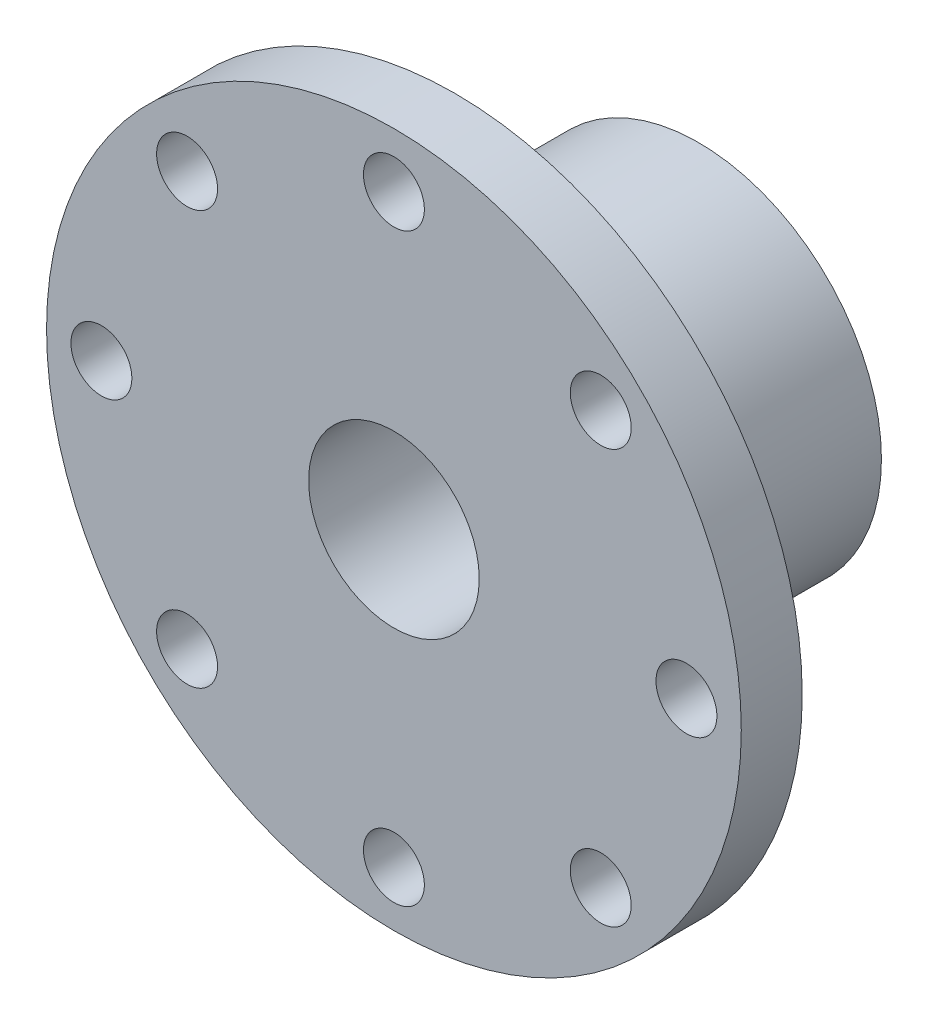
ISO-10303-21;
HEADER;
FILE_DESCRIPTION(('STEP AP214'),'2;1');
FILE_NAME('part.step','',(''),(''),'','','');
FILE_SCHEMA(('AUTOMOTIVE_DESIGN { 1 0 10303 214 1 1 1 1 }'));
ENDSEC;
DATA;
#1=APPLICATION_CONTEXT('core data for automotive mechanical design processes');
#2=APPLICATION_PROTOCOL_DEFINITION('international standard','automotive_design',2000,#1);
#3=PRODUCT_CONTEXT('',#1,'mechanical');
#4=PRODUCT('Part','Part','',(#3));
#5=PRODUCT_RELATED_PRODUCT_CATEGORY('part','',(#4));
#6=PRODUCT_DEFINITION_FORMATION('','',#4);
#7=PRODUCT_DEFINITION_CONTEXT('part definition',#1,'design');
#8=PRODUCT_DEFINITION('design','',#6,#7);
#9=PRODUCT_DEFINITION_SHAPE('','',#8);
#10=(LENGTH_UNIT() NAMED_UNIT(*) SI_UNIT(.MILLI.,.METRE.));
#11=(NAMED_UNIT(*) PLANE_ANGLE_UNIT() SI_UNIT($,.RADIAN.));
#12=(NAMED_UNIT(*) SI_UNIT($,.STERADIAN.) SOLID_ANGLE_UNIT());
#13=UNCERTAINTY_MEASURE_WITH_UNIT(LENGTH_MEASURE(1.E-05),#10,'distance_accuracy_value','');
#14=(GEOMETRIC_REPRESENTATION_CONTEXT(3) GLOBAL_UNCERTAINTY_ASSIGNED_CONTEXT((#13)) GLOBAL_UNIT_ASSIGNED_CONTEXT((#10,
#11,#12)) REPRESENTATION_CONTEXT('',''));
#15=CARTESIAN_POINT('',(0.,0.,0.));
#16=DIRECTION('',(0.,0.,1.));
#17=DIRECTION('',(1.,0.,0.));
#18=AXIS2_PLACEMENT_3D('',#15,#16,#17);
#19=CARTESIAN_POINT('',(0.,0.,0.));
#20=DIRECTION('',(0.,0.,1.));
#21=DIRECTION('',(1.,0.,0.));
#22=AXIS2_PLACEMENT_3D('',#19,#20,#21);
#23=PLANE('',#22);
#24=CARTESIAN_POINT('',(0.,0.,0.));
#25=DIRECTION('',(0.,0.,1.));
#26=DIRECTION('',(1.,0.,0.));
#27=AXIS2_PLACEMENT_3D('',#24,#25,#26);
#28=CIRCLE('',#27,15.);
#29=CARTESIAN_POINT('',(15.,0.,0.));
#30=VERTEX_POINT('',#29);
#31=EDGE_CURVE('E51',#30,#30,#28,.T.);
#32=ORIENTED_EDGE('',*,*,#31,.F.);
#33=EDGE_LOOP('',(#32));
#34=FACE_BOUND('',#33,.T.);
#35=CARTESIAN_POINT('',(0.,0.,0.));
#36=DIRECTION('',(0.,0.,1.));
#37=DIRECTION('',(1.,0.,0.));
#38=AXIS2_PLACEMENT_3D('',#35,#36,#37);
#39=CIRCLE('',#38,7.);
#40=CARTESIAN_POINT('',(7.,0.,0.));
#41=VERTEX_POINT('',#40);
#42=EDGE_CURVE('E57',#41,#41,#39,.T.);
#43=ORIENTED_EDGE('',*,*,#42,.T.);
#44=EDGE_LOOP('',(#43));
#45=FACE_BOUND('',#44,.T.);
#46=ADVANCED_FACE('F36',(#34,#45),#23,.F.);
#47=CARTESIAN_POINT('',(0.,0.,20.));
#48=DIRECTION('',(0.,0.,-1.));
#49=DIRECTION('',(-1.,0.,0.));
#50=AXIS2_PLACEMENT_3D('',#47,#48,#49);
#51=CYLINDRICAL_SURFACE('',#50,15.);
#52=CARTESIAN_POINT('',(0.,-15.,13.));
#53=CARTESIAN_POINT('',(0.166730720377901,-14.9999969274261,12.999993866505));
#54=CARTESIAN_POINT('',(0.333538980604568,-14.9971915553469,12.9860534710971));
#55=CARTESIAN_POINT('',(0.662440523067059,-14.9862709686969,12.9307044996543));
#56=CARTESIAN_POINT('',(0.824529952624069,-14.9781515358056,12.8892741015955));
#57=CARTESIAN_POINT('',(1.13919091578994,-14.9575094783486,12.7802761791376));
#58=CARTESIAN_POINT('',(1.2917714037994,-14.9449910723015,12.7127336894659));
#59=CARTESIAN_POINT('',(1.58342396659268,-14.9169119410594,12.5535032574661));
#60=CARTESIAN_POINT('',(1.72249684522744,-14.9013513970712,12.4618167531784));
#61=CARTESIAN_POINT('',(1.9850804319446,-14.8686649598991,12.2555845171257));
#62=CARTESIAN_POINT('',(2.10838185347558,-14.8515223651304,12.1407749338264));
#63=CARTESIAN_POINT('',(2.33411026982409,-14.8177254135776,11.8921227508249));
#64=CARTESIAN_POINT('',(2.43653563431128,-14.8010710950127,11.7582786659946));
#65=CARTESIAN_POINT('',(2.61849526004286,-14.7699732543785,11.4738514209644));
#66=CARTESIAN_POINT('',(2.6978128165976,-14.7555512209484,11.3231270686109));
#67=CARTESIAN_POINT('',(2.82991699974093,-14.7307880417525,11.0101545429878));
#68=CARTESIAN_POINT('',(2.88270624731171,-14.7204464928588,10.847907509961));
#69=CARTESIAN_POINT('',(2.95957589965448,-14.7051841575661,10.5187469082763));
#70=CARTESIAN_POINT('',(2.98402349387633,-14.7001941032156,10.3519223675733));
#71=CARTESIAN_POINT('',(3.00465638317836,-14.6959912518188,10.016470535907));
#72=CARTESIAN_POINT('',(3.0008445681405,-14.6967778640352,9.84784343103956));
#73=CARTESIAN_POINT('',(2.96536371930546,-14.7039765344455,9.51625963593699));
#74=CARTESIAN_POINT('',(2.93411562073172,-14.7103035857629,9.35325578311806));
#75=CARTESIAN_POINT('',(2.84531365386915,-14.7277363848,9.03485177001099));
#76=CARTESIAN_POINT('',(2.78775852930204,-14.7388423607334,8.87945197324298));
#77=CARTESIAN_POINT('',(2.64757435102416,-14.7646685550122,8.5794542148892));
#78=CARTESIAN_POINT('',(2.56477845369634,-14.7794126944111,8.43493636129248));
#79=CARTESIAN_POINT('',(2.37658072371804,-14.8108385631919,8.16168745008156));
#80=CARTESIAN_POINT('',(2.27117629307049,-14.827520515151,8.03295820944653));
#81=CARTESIAN_POINT('',(2.03849980368175,-14.8613106372439,7.79251179262919));
#82=CARTESIAN_POINT('',(1.91086848363734,-14.8784210763271,7.68114229642261));
#83=CARTESIAN_POINT('',(1.63855507218603,-14.9108654614323,7.48133846109633));
#84=CARTESIAN_POINT('',(1.49387276213817,-14.9261993846692,7.39290441611926));
#85=CARTESIAN_POINT('',(1.19117816063676,-14.9534007048266,7.24141747232207));
#86=CARTESIAN_POINT('',(1.0331454587559,-14.9652626654482,7.17840431906639));
#87=CARTESIAN_POINT('',(0.708446929345997,-14.9841422696357,7.0799185778843));
#88=CARTESIAN_POINT('',(0.54178215021735,-14.9911605000159,7.04444265377912));
#89=CARTESIAN_POINT('',(0.207538216881453,-14.999480156006,7.00253063861717));
#90=CARTESIAN_POINT('',(0.0400209849767297,-15.0008752395741,6.99561874137919));
#91=CARTESIAN_POINT('',(-0.293774802578142,-14.9980515579031,7.00974957682654));
#92=CARTESIAN_POINT('',(-0.460053427331379,-14.9938331082434,7.03079073805779));
#93=CARTESIAN_POINT('',(-0.785116979839622,-14.9803149602405,7.09983512063187));
#94=CARTESIAN_POINT('',(-0.943955845019709,-14.9710612921262,7.14759420549371));
#95=CARTESIAN_POINT('',(-1.251370882499,-14.948506561831,7.26845194796743));
#96=CARTESIAN_POINT('',(-1.39994628491262,-14.9352051964268,7.34155250403049));
#97=CARTESIAN_POINT('',(-1.68462352105865,-14.9057973459988,7.51204747195394));
#98=CARTESIAN_POINT('',(-1.82055038025656,-14.8896585131116,7.60972834311684));
#99=CARTESIAN_POINT('',(-2.07425405735762,-14.8564420448965,7.82622757362184));
#100=CARTESIAN_POINT('',(-2.19202892679229,-14.8393643090516,7.9450481991996));
#101=CARTESIAN_POINT('',(-2.40792177232253,-14.8058791067089,8.20262005567337));
#102=CARTESIAN_POINT('',(-2.50571310734596,-14.7894858069991,8.34164723266401));
#103=CARTESIAN_POINT('',(-2.67655626015362,-14.7595257538858,8.63443408407004));
#104=CARTESIAN_POINT('',(-2.74960906776871,-14.7459588874003,8.78819316872066));
#105=CARTESIAN_POINT('',(-2.86845552474588,-14.7233022175315,9.10530473844865));
#106=CARTESIAN_POINT('',(-2.91439049937315,-14.7141892461656,9.26860252363096));
#107=CARTESIAN_POINT('',(-2.97812595488159,-14.7014231037608,9.60080036047272));
#108=CARTESIAN_POINT('',(-2.99593010467534,-14.6977692207333,9.76969967862804));
#109=CARTESIAN_POINT('',(-3.0027627326024,-14.6963744889414,10.105026593633));
#110=CARTESIAN_POINT('',(-2.99230736421269,-14.698527575679,10.271443446781));
#111=CARTESIAN_POINT('',(-2.94405691230018,-14.7082672045384,10.6000949497151));
#112=CARTESIAN_POINT('',(-2.90626204838789,-14.7158537030151,10.7623296330844));
#113=CARTESIAN_POINT('',(-2.80463570549686,-14.7355579265748,11.0776831337216));
#114=CARTESIAN_POINT('',(-2.74086752015203,-14.7476646305649,11.2308230815072));
#115=CARTESIAN_POINT('',(-2.58916393380481,-14.7750514492251,11.5243111622033));
#116=CARTESIAN_POINT('',(-2.50122650632464,-14.7903318299668,11.6646582211754));
#117=CARTESIAN_POINT('',(-2.30191774435924,-14.8226688156968,11.9311467164509));
#118=CARTESIAN_POINT('',(-2.19017366170554,-14.839751187291,12.0570062958028));
#119=CARTESIAN_POINT('',(-1.94719310703942,-14.8735824561586,12.2883586165875));
#120=CARTESIAN_POINT('',(-1.81595216146,-14.8903312758955,12.3938466709518));
#121=CARTESIAN_POINT('',(-1.53605288726474,-14.9218149716391,12.5825039318393));
#122=CARTESIAN_POINT('',(-1.3872266532895,-14.9365269365774,12.6654280098401));
#123=CARTESIAN_POINT('',(-1.0774990828222,-14.96205375255,12.8049583677898));
#124=CARTESIAN_POINT('',(-0.916608782589376,-14.9728721141585,12.8615883685975));
#125=CARTESIAN_POINT('',(-0.629464466771335,-14.9872911778611,12.9359558441341));
#126=CARTESIAN_POINT('',(-0.504844992041351,-14.9920290947535,12.9599295811233));
#127=CARTESIAN_POINT('',(-0.253498575630199,-14.9983846241968,12.9919537370751));
#128=CARTESIAN_POINT('',(-0.126771701245856,-15.0000023361946,13.0000046635293));
#129=CARTESIAN_POINT('',(0.,-15.,13.));
#130=B_SPLINE_CURVE_WITH_KNOTS('',3,(#52,#53,#54,#55,#56,#57,#58,#59,#60,#61,#62,#63,#64,#65,
#66,#67,#68,#69,#70,#71,#72,#73,#74,#75,#76,#77,#78,#79,#80,#81,#82,#83,#84,#85,#86,#87,#88,#89,
#90,#91,#92,#93,#94,#95,#96,#97,#98,#99,#100,#101,#102,#103,#104,#105,#106,#107,#108,#109,#110,
#111,#112,#113,#114,#115,#116,#117,#118,#119,#120,#121,#122,#123,#124,#125,#126,#127,#128,#129),
.UNSPECIFIED.,.T.,.F.,(4,2,2,2,2,2,2,2,2,2,2,2,2,2,2,2,2,2,2,2,2,2,2,2,2,2,2,2,2,2,2,2,2,2,2,2,
2,2,4),(0.,0.499728391983775,0.99985395207397,1.49950120575103,1.99911870669259,
2.50479801033656,3.0105167902421,3.52083585017768,4.03110448095592,4.53468555310762,
5.03821512843675,5.53415181018835,6.03011217761189,6.52942470610778,7.02879464249011,
7.53714757474052,8.04550702619461,8.55465824562072,9.06374777094108,9.56432207028796,
10.064868229736,10.5609136185217,11.0569961764807,11.5591519810008,12.0613616503779,
12.5712188573768,13.081055661704,13.5882114309817,14.0953010499124,14.593191677031,
15.0910783047783,15.5877588375933,16.084481027456,16.5896422871743,17.0949196359879,
17.6054849002691,18.1155886655256,18.4955632586968,18.8755257411299),.UNSPECIFIED.);
#131=CARTESIAN_POINT('',(0.,-15.,13.));
#132=VERTEX_POINT('',#131);
#133=EDGE_CURVE('E80',#132,#132,#130,.T.);
#134=ORIENTED_EDGE('',*,*,#133,.T.);
#135=EDGE_LOOP('',(#134));
#136=FACE_BOUND('',#135,.T.);
#137=CARTESIAN_POINT('',(0.,0.,20.));
#138=DIRECTION('',(0.,0.,1.));
#139=DIRECTION('',(1.,0.,0.));
#140=AXIS2_PLACEMENT_3D('',#137,#138,#139);
#141=CIRCLE('',#140,15.);
#142=CARTESIAN_POINT('',(15.,0.,20.));
#143=VERTEX_POINT('',#142);
#144=EDGE_CURVE('E10',#143,#143,#141,.T.);
#145=ORIENTED_EDGE('',*,*,#144,.F.);
#146=EDGE_LOOP('',(#145));
#147=FACE_BOUND('',#146,.T.);
#148=ORIENTED_EDGE('',*,*,#31,.T.);
#149=EDGE_LOOP('',(#148));
#150=FACE_BOUND('',#149,.T.);
#151=ADVANCED_FACE('F38',(#136,#147,#150),#51,.T.);
#152=CARTESIAN_POINT('',(0.,0.,20.));
#153=DIRECTION('',(0.,0.,-1.));
#154=DIRECTION('',(-1.,0.,0.));
#155=AXIS2_PLACEMENT_3D('',#152,#153,#154);
#156=CYLINDRICAL_SURFACE('',#155,7.);
#157=CARTESIAN_POINT('',(0.,-7.,13.));
#158=CARTESIAN_POINT('',(0.160281740269092,-6.9999940839629,12.9999925304185));
#159=CARTESIAN_POINT('',(0.320833907522431,-6.99443250051265,12.9870786839035));
#160=CARTESIAN_POINT('',(0.637349314958985,-6.97273920628719,12.9359176345735));
#161=CARTESIAN_POINT('',(0.793299928144208,-6.95658080950724,12.8976064709267));
#162=CARTESIAN_POINT('',(1.0955347051483,-6.91541630739346,12.7973302363749));
#163=CARTESIAN_POINT('',(1.24185033642246,-6.89044089228941,12.7354471561946));
#164=CARTESIAN_POINT('',(1.5218733278968,-6.83405660276648,12.5901355814363));
#165=CARTESIAN_POINT('',(1.65558409053381,-6.80264947176647,12.5067129239082));
#166=CARTESIAN_POINT('',(1.91384144205639,-6.73467821875549,12.3160723523121));
#167=CARTESIAN_POINT('',(2.03764045493602,-6.69793895962371,12.2079047401042));
#168=CARTESIAN_POINT('',(2.26599040232609,-6.62417654338771,11.9728561314992));
#169=CARTESIAN_POINT('',(2.3705306503261,-6.5871532404671,11.8459648153973));
#170=CARTESIAN_POINT('',(2.56285686126493,-6.51482055271223,11.5689672772845));
#171=CARTESIAN_POINT('',(2.64946811752636,-6.47970460244924,11.4179895419707));
#172=CARTESIAN_POINT('',(2.79573199408101,-6.41796168635026,11.101890571811));
#173=CARTESIAN_POINT('',(2.8553992914263,-6.39133010120133,10.9367770955138));
#174=CARTESIAN_POINT('',(2.94294919918375,-6.35147799087276,10.6056992616908));
#175=CARTESIAN_POINT('',(2.97227494401777,-6.33765221435539,10.4401922982205));
#176=CARTESIAN_POINT('',(3.00280607158394,-6.32324849688131,10.1060740303897));
#177=CARTESIAN_POINT('',(3.00402828615096,-6.32266262625149,9.93746464470862));
#178=CARTESIAN_POINT('',(2.97939999510613,-6.33429573902539,9.61670009628145));
#179=CARTESIAN_POINT('',(2.95576113815072,-6.34546870930158,9.464329376668));
#180=CARTESIAN_POINT('',(2.88580772808799,-6.37758411517576,9.16597241409867));
#181=CARTESIAN_POINT('',(2.83948852833539,-6.39852855266591,9.01998748611386));
#182=CARTESIAN_POINT('',(2.72457659070691,-6.44830685655465,8.73475284856477));
#183=CARTESIAN_POINT('',(2.65551974428426,-6.47730295111391,8.59571970578186));
#184=CARTESIAN_POINT('',(2.49742304873013,-6.53988493882129,8.33065367593057));
#185=CARTESIAN_POINT('',(2.40837507480489,-6.57347269593628,8.20462610507051));
#186=CARTESIAN_POINT('',(2.20343405392229,-6.64512404535213,7.95722249637862));
#187=CARTESIAN_POINT('',(2.08584728856133,-6.68331855389208,7.83728327052803));
#188=CARTESIAN_POINT('',(1.83187332405077,-6.75734605758523,7.61832840934405));
#189=CARTESIAN_POINT('',(1.6954812162799,-6.79317843254652,7.51931825412179));
#190=CARTESIAN_POINT('',(1.40318582301272,-6.8595969368957,7.34275606719303));
#191=CARTESIAN_POINT('',(1.24687114970232,-6.89002455033727,7.26582098129442));
#192=CARTESIAN_POINT('',(0.921879694158937,-6.94097396260558,7.13984976238528));
#193=CARTESIAN_POINT('',(0.753210215657667,-6.9615015603998,7.0907972940223));
#194=CARTESIAN_POINT('',(0.420276238941372,-6.98923526893385,7.02506613954103));
#195=CARTESIAN_POINT('',(0.256457961010926,-6.99723249964589,7.00646123468561));
#196=CARTESIAN_POINT('',(-0.0721433011185054,-7.00155416651738,6.99637042359177));
#197=CARTESIAN_POINT('',(-0.236925971900555,-6.99788220531666,7.00487614746763));
#198=CARTESIAN_POINT('',(-0.55354243962667,-6.9797867632015,7.04741563205481));
#199=CARTESIAN_POINT('',(-0.705598931504216,-6.96594519473644,7.08006832144833));
#200=CARTESIAN_POINT('',(-1.00189113639242,-6.92953888009974,7.16802089423816));
#201=CARTESIAN_POINT('',(-1.14612587370002,-6.90697304848521,7.22332359572216));
#202=CARTESIAN_POINT('',(-1.42777696523888,-6.85438751513719,7.35680115950212));
#203=CARTESIAN_POINT('',(-1.56483974951836,-6.82415705388474,7.43563633022606));
#204=CARTESIAN_POINT('',(-1.82428490564705,-6.75942988391438,7.61321894447594));
#205=CARTESIAN_POINT('',(-1.94666097512992,-6.72493135648758,7.71197488802329));
#206=CARTESIAN_POINT('',(-2.18296759532595,-6.65214788697903,7.93528958784289));
#207=CARTESIAN_POINT('',(-2.29556617553686,-6.61377354998591,8.06123221006139));
#208=CARTESIAN_POINT('',(-2.49843431443676,-6.53984037690252,8.33078229863161));
#209=CARTESIAN_POINT('',(-2.58869766421195,-6.50428232556792,8.47439466037483));
#210=CARTESIAN_POINT('',(-2.74563875632303,-6.43962969285319,8.77881385295857));
#211=CARTESIAN_POINT('',(-2.81186415020233,-6.41066255987443,8.93988300904999));
#212=CARTESIAN_POINT('',(-2.91565885028324,-6.36413607530145,9.2725263267395));
#213=CARTESIAN_POINT('',(-2.95325364225748,-6.346566580073,9.44409099832457));
#214=CARTESIAN_POINT('',(-2.9961194841997,-6.32643481136621,9.77799117233295));
#215=CARTESIAN_POINT('',(-3.00374693238451,-6.3227792566546,9.93995926751058));
#216=CARTESIAN_POINT('',(-2.99282649265778,-6.32795618271386,10.2627897469115));
#217=CARTESIAN_POINT('',(-2.97428322126543,-6.33678646098226,10.4236523211193));
#218=CARTESIAN_POINT('',(-2.91356431394149,-6.3649165389077,10.7310416962734));
#219=CARTESIAN_POINT('',(-2.87266975661121,-6.38364713099396,10.8778787915708));
#220=CARTESIAN_POINT('',(-2.769702223632,-6.42898875831973,11.1626207660839));
#221=CARTESIAN_POINT('',(-2.70762322652258,-6.45560203384715,11.3005230924077));
#222=CARTESIAN_POINT('',(-2.55963250501149,-6.5157524732596,11.5728207086796));
#223=CARTESIAN_POINT('',(-2.47248232196069,-6.5496164957701,11.7064691536948));
#224=CARTESIAN_POINT('',(-2.2784960092513,-6.61959778926566,11.9579823612475));
#225=CARTESIAN_POINT('',(-2.17165243666714,-6.6557159087398,12.0758411270492));
#226=CARTESIAN_POINT('',(-1.93135048700133,-6.72955424641834,12.3020036355007));
#227=CARTESIAN_POINT('',(-1.79645724733279,-6.76717599448736,12.4088195655728));
#228=CARTESIAN_POINT('',(-1.50919760355001,-6.83696477009089,12.5984397600312));
#229=CARTESIAN_POINT('',(-1.35682332068822,-6.86912932173673,12.6812331375999));
#230=CARTESIAN_POINT('',(-1.11954532843042,-6.91035442086788,12.7845926909895));
#231=CARTESIAN_POINT('',(-1.03957288024831,-6.92286397965452,12.8154332908018));
#232=CARTESIAN_POINT('',(-0.876970802782698,-6.94533202163241,12.8702382020223));
#233=CARTESIAN_POINT('',(-0.794342461515167,-6.95529172101821,12.8942057922754));
#234=CARTESIAN_POINT('',(-0.627265567421397,-6.97234378079151,12.9349477172834));
#235=CARTESIAN_POINT('',(-0.542821986677286,-6.97944312738119,12.9517395843805));
#236=CARTESIAN_POINT('',(-0.372647906839315,-6.99059319635283,12.9780087142034));
#237=CARTESIAN_POINT('',(-0.286918376030205,-6.99464610559385,12.9874912240139));
#238=CARTESIAN_POINT('',(-0.167492669563776,-6.99807592564235,12.9955082749436));
#239=CARTESIAN_POINT('',(-0.134021137958666,-6.99879677015532,12.9971918541176));
#240=CARTESIAN_POINT('',(-0.0670370145842108,-6.99975942751561,12.9994385012841));
#241=CARTESIAN_POINT('',(-0.0335244225617051,-7.0000012373944,13.0000015623327));
#242=CARTESIAN_POINT('',(0.,-7.,13.));
#243=B_SPLINE_CURVE_WITH_KNOTS('',3,(#157,#158,#159,#160,#161,#162,#163,#164,#165,#166,#167,
#168,#169,#170,#171,#172,#173,#174,#175,#176,#177,#178,#179,#180,#181,#182,#183,#184,#185,#186,
#187,#188,#189,#190,#191,#192,#193,#194,#195,#196,#197,#198,#199,#200,#201,#202,#203,#204,#205,
#206,#207,#208,#209,#210,#211,#212,#213,#214,#215,#216,#217,#218,#219,#220,#221,#222,#223,#224,
#225,#226,#227,#228,#229,#230,#231,#232,#233,#234,#235,#236,#237,#238,#239,#240,#241,#242),
.UNSPECIFIED.,.T.,.F.,(4,2,2,2,2,2,2,2,2,2,2,2,2,2,2,2,2,2,2,2,2,2,2,2,2,2,2,2,2,2,2,2,2,2,2,2,
2,2,2,2,2,2,4),(0.,0.480714322748849,0.962643903423346,1.44291226275142,1.92305060961531,
2.42622743558506,2.92968263421744,3.45969560860062,3.98941952228263,4.492594268281,
4.99546764377915,5.45710720323576,5.91884138089948,6.3906540887232,6.86265889892286,
7.37709837725841,7.89167239108963,8.41947244601234,8.94696296364742,9.43957347502028,
9.93203191709568,10.3983119423363,10.8646499992176,11.3455505516221,11.8266567358409,
12.3440285038672,12.8615439335848,13.3883469079738,13.9146803943341,14.3986848887267,
14.882604015318,15.341320451094,15.8001673810816,16.2874475008663,16.7749121624767,
17.3008416934143,17.8270092002163,18.0865840789243,18.3460349177801,18.6048481685098,
18.8634754544625,18.964020720529,19.0645666096629),.UNSPECIFIED.);
#244=CARTESIAN_POINT('',(0.,-7.,13.));
#245=VERTEX_POINT('',#244);
#246=EDGE_CURVE('E41',#245,#245,#243,.T.);
#247=ORIENTED_EDGE('',*,*,#246,.F.);
#248=EDGE_LOOP('',(#247));
#249=FACE_BOUND('',#248,.T.);
#250=ORIENTED_EDGE('',*,*,#42,.F.);
#251=EDGE_LOOP('',(#250));
#252=FACE_BOUND('',#251,.T.);
#253=CARTESIAN_POINT('',(0.,0.,25.));
#254=DIRECTION('',(0.,0.,1.));
#255=DIRECTION('',(1.,0.,0.));
#256=AXIS2_PLACEMENT_3D('',#253,#254,#255);
#257=CIRCLE('',#256,7.);
#258=CARTESIAN_POINT('',(7.,0.,25.));
#259=VERTEX_POINT('',#258);
#260=EDGE_CURVE('E67',#259,#259,#257,.T.);
#261=ORIENTED_EDGE('',*,*,#260,.T.);
#262=EDGE_LOOP('',(#261));
#263=FACE_BOUND('',#262,.T.);
#264=ADVANCED_FACE('F187',(#249,#252,#263),#156,.F.);
#265=CARTESIAN_POINT('',(0.,0.,25.));
#266=DIRECTION('',(0.,0.,1.));
#267=DIRECTION('',(1.,0.,0.));
#268=AXIS2_PLACEMENT_3D('',#265,#266,#267);
#269=PLANE('',#268);
#270=CARTESIAN_POINT('',(0.,-24.,25.));
#271=DIRECTION('',(0.,0.,1.));
#272=DIRECTION('',(1.,0.,0.));
#273=AXIS2_PLACEMENT_3D('',#270,#271,#272);
#274=CIRCLE('',#273,2.5);
#275=CARTESIAN_POINT('',(2.5,-24.,25.));
#276=VERTEX_POINT('',#275);
#277=EDGE_CURVE('E132',#276,#276,#274,.T.);
#278=ORIENTED_EDGE('',*,*,#277,.F.);
#279=EDGE_LOOP('',(#278));
#280=FACE_BOUND('',#279,.T.);
#281=CARTESIAN_POINT('',(-16.9705627484772,-16.9705627484771,25.));
#282=DIRECTION('',(0.,0.,1.));
#283=DIRECTION('',(1.,0.,0.));
#284=AXIS2_PLACEMENT_3D('',#281,#282,#283);
#285=CIRCLE('',#284,2.5);
#286=CARTESIAN_POINT('',(-14.4705627484772,-16.9705627484771,25.));
#287=VERTEX_POINT('',#286);
#288=EDGE_CURVE('E124',#287,#287,#285,.T.);
#289=ORIENTED_EDGE('',*,*,#288,.F.);
#290=EDGE_LOOP('',(#289));
#291=FACE_BOUND('',#290,.T.);
#292=CARTESIAN_POINT('',(-24.,0.,25.));
#293=DIRECTION('',(0.,0.,1.));
#294=DIRECTION('',(1.,0.,0.));
#295=AXIS2_PLACEMENT_3D('',#292,#293,#294);
#296=CIRCLE('',#295,2.5);
#297=CARTESIAN_POINT('',(-21.5,0.,25.));
#298=VERTEX_POINT('',#297);
#299=EDGE_CURVE('E116',#298,#298,#296,.T.);
#300=ORIENTED_EDGE('',*,*,#299,.F.);
#301=EDGE_LOOP('',(#300));
#302=FACE_BOUND('',#301,.T.);
#303=CARTESIAN_POINT('',(-16.970562748477,16.9705627484772,25.));
#304=DIRECTION('',(0.,0.,1.));
#305=DIRECTION('',(1.,0.,0.));
#306=AXIS2_PLACEMENT_3D('',#303,#304,#305);
#307=CIRCLE('',#306,2.5);
#308=CARTESIAN_POINT('',(-14.470562748477,16.9705627484772,25.));
#309=VERTEX_POINT('',#308);
#310=EDGE_CURVE('E108',#309,#309,#307,.T.);
#311=ORIENTED_EDGE('',*,*,#310,.F.);
#312=EDGE_LOOP('',(#311));
#313=FACE_BOUND('',#312,.T.);
#314=CARTESIAN_POINT('',(1.6759110426447E-13,24.,25.));
#315=DIRECTION('',(0.,0.,1.));
#316=DIRECTION('',(1.,0.,0.));
#317=AXIS2_PLACEMENT_3D('',#314,#315,#316);
#318=CIRCLE('',#317,2.5);
#319=CARTESIAN_POINT('',(2.50000000000017,24.,25.));
#320=VERTEX_POINT('',#319);
#321=EDGE_CURVE('E100',#320,#320,#318,.T.);
#322=ORIENTED_EDGE('',*,*,#321,.F.);
#323=EDGE_LOOP('',(#322));
#324=FACE_BOUND('',#323,.T.);
#325=CARTESIAN_POINT('',(16.9705627484773,16.970562748477,25.));
#326=DIRECTION('',(0.,0.,1.));
#327=DIRECTION('',(1.,0.,0.));
#328=AXIS2_PLACEMENT_3D('',#325,#326,#327);
#329=CIRCLE('',#328,2.5);
#330=CARTESIAN_POINT('',(19.4705627484773,16.970562748477,25.));
#331=VERTEX_POINT('',#330);
#332=EDGE_CURVE('E92',#331,#331,#329,.T.);
#333=ORIENTED_EDGE('',*,*,#332,.F.);
#334=EDGE_LOOP('',(#333));
#335=FACE_BOUND('',#334,.T.);
#336=CARTESIAN_POINT('',(24.,-2.51386656396706E-13,25.));
#337=DIRECTION('',(0.,0.,1.));
#338=DIRECTION('',(1.,0.,0.));
#339=AXIS2_PLACEMENT_3D('',#336,#337,#338);
#340=CIRCLE('',#339,2.5);
#341=CARTESIAN_POINT('',(26.5,-2.51386656396706E-13,25.));
#342=VERTEX_POINT('',#341);
#343=EDGE_CURVE('E84',#342,#342,#340,.T.);
#344=ORIENTED_EDGE('',*,*,#343,.F.);
#345=EDGE_LOOP('',(#344));
#346=FACE_BOUND('',#345,.T.);
#347=CARTESIAN_POINT('',(16.9705627484769,-16.9705627484774,25.));
#348=DIRECTION('',(0.,0.,1.));
#349=DIRECTION('',(1.,0.,0.));
#350=AXIS2_PLACEMENT_3D('',#347,#348,#349);
#351=CIRCLE('',#350,2.5);
#352=CARTESIAN_POINT('',(19.4705627484769,-16.9705627484774,25.));
#353=VERTEX_POINT('',#352);
#354=EDGE_CURVE('E75',#353,#353,#351,.T.);
#355=ORIENTED_EDGE('',*,*,#354,.F.);
#356=EDGE_LOOP('',(#355));
#357=FACE_BOUND('',#356,.T.);
#358=CARTESIAN_POINT('',(0.,0.,25.));
#359=DIRECTION('',(0.,0.,1.));
#360=DIRECTION('',(1.,0.,0.));
#361=AXIS2_PLACEMENT_3D('',#358,#359,#360);
#362=CIRCLE('',#361,28.5);
#363=CARTESIAN_POINT('',(28.5,0.,25.));
#364=VERTEX_POINT('',#363);
#365=EDGE_CURVE('E62',#364,#364,#362,.T.);
#366=ORIENTED_EDGE('',*,*,#365,.T.);
#367=EDGE_LOOP('',(#366));
#368=FACE_BOUND('',#367,.T.);
#369=ORIENTED_EDGE('',*,*,#260,.F.);
#370=EDGE_LOOP('',(#369));
#371=FACE_BOUND('',#370,.T.);
#372=ADVANCED_FACE('F183',(#280,#291,#302,#313,#324,#335,#346,#357,#368,#371),#269,.T.);
#373=CARTESIAN_POINT('',(0.,0.,20.));
#374=DIRECTION('',(0.,0.,1.));
#375=DIRECTION('',(1.,0.,0.));
#376=AXIS2_PLACEMENT_3D('',#373,#374,#375);
#377=PLANE('',#376);
#378=CARTESIAN_POINT('',(0.,-24.,20.));
#379=DIRECTION('',(0.,0.,1.));
#380=DIRECTION('',(1.,0.,0.));
#381=AXIS2_PLACEMENT_3D('',#378,#379,#380);
#382=CIRCLE('',#381,2.5);
#383=CARTESIAN_POINT('',(2.5,-24.,20.));
#384=VERTEX_POINT('',#383);
#385=EDGE_CURVE('E74',#384,#384,#382,.T.);
#386=ORIENTED_EDGE('',*,*,#385,.T.);
#387=EDGE_LOOP('',(#386));
#388=FACE_BOUND('',#387,.T.);
#389=CARTESIAN_POINT('',(-16.9705627484772,-16.9705627484771,20.));
#390=DIRECTION('',(0.,0.,1.));
#391=DIRECTION('',(1.,0.,0.));
#392=AXIS2_PLACEMENT_3D('',#389,#390,#391);
#393=CIRCLE('',#392,2.5);
#394=CARTESIAN_POINT('',(-14.4705627484772,-16.9705627484771,20.));
#395=VERTEX_POINT('',#394);
#396=EDGE_CURVE('E128',#395,#395,#393,.T.);
#397=ORIENTED_EDGE('',*,*,#396,.T.);
#398=EDGE_LOOP('',(#397));
#399=FACE_BOUND('',#398,.T.);
#400=CARTESIAN_POINT('',(-24.,0.,20.));
#401=DIRECTION('',(0.,0.,1.));
#402=DIRECTION('',(1.,0.,0.));
#403=AXIS2_PLACEMENT_3D('',#400,#401,#402);
#404=CIRCLE('',#403,2.5);
#405=CARTESIAN_POINT('',(-21.5,0.,20.));
#406=VERTEX_POINT('',#405);
#407=EDGE_CURVE('E120',#406,#406,#404,.T.);
#408=ORIENTED_EDGE('',*,*,#407,.T.);
#409=EDGE_LOOP('',(#408));
#410=FACE_BOUND('',#409,.T.);
#411=CARTESIAN_POINT('',(-16.970562748477,16.9705627484772,20.));
#412=DIRECTION('',(0.,0.,1.));
#413=DIRECTION('',(1.,0.,0.));
#414=AXIS2_PLACEMENT_3D('',#411,#412,#413);
#415=CIRCLE('',#414,2.5);
#416=CARTESIAN_POINT('',(-14.470562748477,16.9705627484772,20.));
#417=VERTEX_POINT('',#416);
#418=EDGE_CURVE('E112',#417,#417,#415,.T.);
#419=ORIENTED_EDGE('',*,*,#418,.T.);
#420=EDGE_LOOP('',(#419));
#421=FACE_BOUND('',#420,.T.);
#422=CARTESIAN_POINT('',(1.6759110426447E-13,24.,20.));
#423=DIRECTION('',(0.,0.,1.));
#424=DIRECTION('',(1.,0.,0.));
#425=AXIS2_PLACEMENT_3D('',#422,#423,#424);
#426=CIRCLE('',#425,2.5);
#427=CARTESIAN_POINT('',(2.50000000000017,24.,20.));
#428=VERTEX_POINT('',#427);
#429=EDGE_CURVE('E104',#428,#428,#426,.T.);
#430=ORIENTED_EDGE('',*,*,#429,.T.);
#431=EDGE_LOOP('',(#430));
#432=FACE_BOUND('',#431,.T.);
#433=CARTESIAN_POINT('',(16.9705627484773,16.970562748477,20.));
#434=DIRECTION('',(0.,0.,1.));
#435=DIRECTION('',(1.,0.,0.));
#436=AXIS2_PLACEMENT_3D('',#433,#434,#435);
#437=CIRCLE('',#436,2.5);
#438=CARTESIAN_POINT('',(19.4705627484773,16.970562748477,20.));
#439=VERTEX_POINT('',#438);
#440=EDGE_CURVE('E96',#439,#439,#437,.T.);
#441=ORIENTED_EDGE('',*,*,#440,.T.);
#442=EDGE_LOOP('',(#441));
#443=FACE_BOUND('',#442,.T.);
#444=CARTESIAN_POINT('',(24.,-2.51386656396706E-13,20.));
#445=DIRECTION('',(0.,0.,1.));
#446=DIRECTION('',(1.,0.,0.));
#447=AXIS2_PLACEMENT_3D('',#444,#445,#446);
#448=CIRCLE('',#447,2.5);
#449=CARTESIAN_POINT('',(26.5,-2.51386656396706E-13,20.));
#450=VERTEX_POINT('',#449);
#451=EDGE_CURVE('E88',#450,#450,#448,.T.);
#452=ORIENTED_EDGE('',*,*,#451,.T.);
#453=EDGE_LOOP('',(#452));
#454=FACE_BOUND('',#453,.T.);
#455=CARTESIAN_POINT('',(16.9705627484769,-16.9705627484774,20.));
#456=DIRECTION('',(0.,0.,1.));
#457=DIRECTION('',(1.,0.,0.));
#458=AXIS2_PLACEMENT_3D('',#455,#456,#457);
#459=CIRCLE('',#458,2.5);
#460=CARTESIAN_POINT('',(19.4705627484769,-16.9705627484774,20.));
#461=VERTEX_POINT('',#460);
#462=EDGE_CURVE('E79',#461,#461,#459,.T.);
#463=ORIENTED_EDGE('',*,*,#462,.T.);
#464=EDGE_LOOP('',(#463));
#465=FACE_BOUND('',#464,.T.);
#466=ORIENTED_EDGE('',*,*,#144,.T.);
#467=EDGE_LOOP('',(#466));
#468=FACE_BOUND('',#467,.T.);
#469=CARTESIAN_POINT('',(0.,0.,20.));
#470=DIRECTION('',(0.,0.,1.));
#471=DIRECTION('',(1.,0.,0.));
#472=AXIS2_PLACEMENT_3D('',#469,#470,#471);
#473=CIRCLE('',#472,28.5);
#474=CARTESIAN_POINT('',(28.5,0.,20.));
#475=VERTEX_POINT('',#474);
#476=EDGE_CURVE('E63',#475,#475,#473,.T.);
#477=ORIENTED_EDGE('',*,*,#476,.F.);
#478=EDGE_LOOP('',(#477));
#479=FACE_BOUND('',#478,.T.);
#480=ADVANCED_FACE('F186',(#388,#399,#410,#421,#432,#443,#454,#465,#468,#479),#377,.F.);
#481=CARTESIAN_POINT('',(0.,0.,25.));
#482=DIRECTION('',(0.,0.,-1.));
#483=DIRECTION('',(-1.,0.,0.));
#484=AXIS2_PLACEMENT_3D('',#481,#482,#483);
#485=CYLINDRICAL_SURFACE('',#484,28.5);
#486=ORIENTED_EDGE('',*,*,#365,.F.);
#487=EDGE_LOOP('',(#486));
#488=FACE_BOUND('',#487,.T.);
#489=ORIENTED_EDGE('',*,*,#476,.T.);
#490=EDGE_LOOP('',(#489));
#491=FACE_BOUND('',#490,.T.);
#492=ADVANCED_FACE('F181',(#488,#491),#485,.T.);
#493=CARTESIAN_POINT('',(16.9705627484769,-16.9705627484774,20.));
#494=DIRECTION('',(0.,0.,1.));
#495=DIRECTION('',(1.,0.,0.));
#496=AXIS2_PLACEMENT_3D('',#493,#494,#495);
#497=CYLINDRICAL_SURFACE('',#496,2.5);
#498=ORIENTED_EDGE('',*,*,#462,.F.);
#499=EDGE_LOOP('',(#498));
#500=FACE_BOUND('',#499,.T.);
#501=ORIENTED_EDGE('',*,*,#354,.T.);
#502=EDGE_LOOP('',(#501));
#503=FACE_BOUND('',#502,.T.);
#504=ADVANCED_FACE('F177',(#500,#503),#497,.F.);
#505=CARTESIAN_POINT('',(24.,-2.51386656396706E-13,20.));
#506=DIRECTION('',(0.,0.,1.));
#507=DIRECTION('',(1.,0.,0.));
#508=AXIS2_PLACEMENT_3D('',#505,#506,#507);
#509=CYLINDRICAL_SURFACE('',#508,2.5);
#510=ORIENTED_EDGE('',*,*,#451,.F.);
#511=EDGE_LOOP('',(#510));
#512=FACE_BOUND('',#511,.T.);
#513=ORIENTED_EDGE('',*,*,#343,.T.);
#514=EDGE_LOOP('',(#513));
#515=FACE_BOUND('',#514,.T.);
#516=ADVANCED_FACE('F173',(#512,#515),#509,.F.);
#517=CARTESIAN_POINT('',(16.9705627484773,16.970562748477,20.));
#518=DIRECTION('',(0.,0.,1.));
#519=DIRECTION('',(1.,0.,0.));
#520=AXIS2_PLACEMENT_3D('',#517,#518,#519);
#521=CYLINDRICAL_SURFACE('',#520,2.5);
#522=ORIENTED_EDGE('',*,*,#440,.F.);
#523=EDGE_LOOP('',(#522));
#524=FACE_BOUND('',#523,.T.);
#525=ORIENTED_EDGE('',*,*,#332,.T.);
#526=EDGE_LOOP('',(#525));
#527=FACE_BOUND('',#526,.T.);
#528=ADVANCED_FACE('F169',(#524,#527),#521,.F.);
#529=CARTESIAN_POINT('',(1.6759110426447E-13,24.,20.));
#530=DIRECTION('',(0.,0.,1.));
#531=DIRECTION('',(1.,0.,0.));
#532=AXIS2_PLACEMENT_3D('',#529,#530,#531);
#533=CYLINDRICAL_SURFACE('',#532,2.5);
#534=ORIENTED_EDGE('',*,*,#429,.F.);
#535=EDGE_LOOP('',(#534));
#536=FACE_BOUND('',#535,.T.);
#537=ORIENTED_EDGE('',*,*,#321,.T.);
#538=EDGE_LOOP('',(#537));
#539=FACE_BOUND('',#538,.T.);
#540=ADVANCED_FACE('F165',(#536,#539),#533,.F.);
#541=CARTESIAN_POINT('',(-16.970562748477,16.9705627484772,20.));
#542=DIRECTION('',(0.,0.,1.));
#543=DIRECTION('',(1.,0.,0.));
#544=AXIS2_PLACEMENT_3D('',#541,#542,#543);
#545=CYLINDRICAL_SURFACE('',#544,2.5);
#546=ORIENTED_EDGE('',*,*,#418,.F.);
#547=EDGE_LOOP('',(#546));
#548=FACE_BOUND('',#547,.T.);
#549=ORIENTED_EDGE('',*,*,#310,.T.);
#550=EDGE_LOOP('',(#549));
#551=FACE_BOUND('',#550,.T.);
#552=ADVANCED_FACE('F161',(#548,#551),#545,.F.);
#553=CARTESIAN_POINT('',(-24.,0.,20.));
#554=DIRECTION('',(0.,0.,1.));
#555=DIRECTION('',(1.,0.,0.));
#556=AXIS2_PLACEMENT_3D('',#553,#554,#555);
#557=CYLINDRICAL_SURFACE('',#556,2.5);
#558=ORIENTED_EDGE('',*,*,#407,.F.);
#559=EDGE_LOOP('',(#558));
#560=FACE_BOUND('',#559,.T.);
#561=ORIENTED_EDGE('',*,*,#299,.T.);
#562=EDGE_LOOP('',(#561));
#563=FACE_BOUND('',#562,.T.);
#564=ADVANCED_FACE('F157',(#560,#563),#557,.F.);
#565=CARTESIAN_POINT('',(-16.9705627484772,-16.9705627484771,20.));
#566=DIRECTION('',(0.,0.,1.));
#567=DIRECTION('',(1.,0.,0.));
#568=AXIS2_PLACEMENT_3D('',#565,#566,#567);
#569=CYLINDRICAL_SURFACE('',#568,2.5);
#570=ORIENTED_EDGE('',*,*,#396,.F.);
#571=EDGE_LOOP('',(#570));
#572=FACE_BOUND('',#571,.T.);
#573=ORIENTED_EDGE('',*,*,#288,.T.);
#574=EDGE_LOOP('',(#573));
#575=FACE_BOUND('',#574,.T.);
#576=ADVANCED_FACE('F153',(#572,#575),#569,.F.);
#577=CARTESIAN_POINT('',(0.,-24.,20.));
#578=DIRECTION('',(0.,0.,1.));
#579=DIRECTION('',(1.,0.,0.));
#580=AXIS2_PLACEMENT_3D('',#577,#578,#579);
#581=CYLINDRICAL_SURFACE('',#580,2.5);
#582=ORIENTED_EDGE('',*,*,#385,.F.);
#583=EDGE_LOOP('',(#582));
#584=FACE_BOUND('',#583,.T.);
#585=ORIENTED_EDGE('',*,*,#277,.T.);
#586=EDGE_LOOP('',(#585));
#587=FACE_BOUND('',#586,.T.);
#588=ADVANCED_FACE('F148',(#584,#587),#581,.F.);
#589=CARTESIAN_POINT('',(0.,-20.,10.));
#590=DIRECTION('',(0.,1.,0.));
#591=DIRECTION('',(0.,0.,1.));
#592=AXIS2_PLACEMENT_3D('',#589,#590,#591);
#593=CYLINDRICAL_SURFACE('',#592,3.);
#594=ORIENTED_EDGE('',*,*,#246,.T.);
#595=EDGE_LOOP('',(#594));
#596=FACE_BOUND('',#595,.T.);
#597=ORIENTED_EDGE('',*,*,#133,.F.);
#598=EDGE_LOOP('',(#597));
#599=FACE_BOUND('',#598,.T.);
#600=ADVANCED_FACE('F144',(#596,#599),#593,.F.);
#601=CLOSED_SHELL('',(#46,#151,#264,#372,#480,#492,#504,#516,#528,#540,#552,#564,#576,#588,#600));
#602=MANIFOLD_SOLID_BREP('B2',#601);
#603=ADVANCED_BREP_SHAPE_REPRESENTATION('',(#18,#602),#14);
#604=SHAPE_DEFINITION_REPRESENTATION(#9,#603);
ENDSEC;
END-ISO-10303-21;
